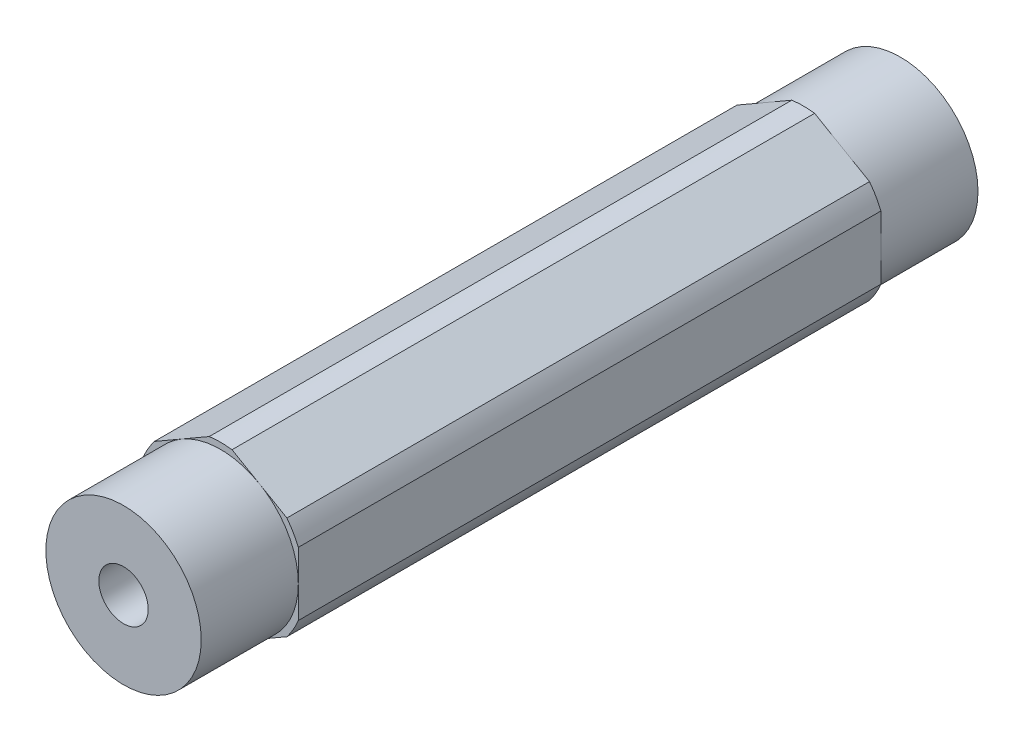
ISO-10303-21;
HEADER;
FILE_DESCRIPTION(('STEP AP214'),'2;1');
FILE_NAME('part.step','',(''),(''),'','','');
FILE_SCHEMA(('AUTOMOTIVE_DESIGN { 1 0 10303 214 1 1 1 1 }'));
ENDSEC;
DATA;
#1=APPLICATION_CONTEXT('core data for automotive mechanical design processes');
#2=APPLICATION_PROTOCOL_DEFINITION('international standard','automotive_design',2000,#1);
#3=PRODUCT_CONTEXT('',#1,'mechanical');
#4=PRODUCT('Part','Part','',(#3));
#5=PRODUCT_RELATED_PRODUCT_CATEGORY('part','',(#4));
#6=PRODUCT_DEFINITION_FORMATION('','',#4);
#7=PRODUCT_DEFINITION_CONTEXT('part definition',#1,'design');
#8=PRODUCT_DEFINITION('design','',#6,#7);
#9=PRODUCT_DEFINITION_SHAPE('','',#8);
#10=(LENGTH_UNIT() NAMED_UNIT(*) SI_UNIT(.MILLI.,.METRE.));
#11=(NAMED_UNIT(*) PLANE_ANGLE_UNIT() SI_UNIT($,.RADIAN.));
#12=(NAMED_UNIT(*) SI_UNIT($,.STERADIAN.) SOLID_ANGLE_UNIT());
#13=UNCERTAINTY_MEASURE_WITH_UNIT(LENGTH_MEASURE(1.E-05),#10,'distance_accuracy_value','');
#14=(GEOMETRIC_REPRESENTATION_CONTEXT(3) GLOBAL_UNCERTAINTY_ASSIGNED_CONTEXT((#13)) GLOBAL_UNIT_ASSIGNED_CONTEXT((#10,
#11,#12)) REPRESENTATION_CONTEXT('',''));
#15=CARTESIAN_POINT('',(0.,0.,0.));
#16=DIRECTION('',(0.,0.,1.));
#17=DIRECTION('',(1.,0.,0.));
#18=AXIS2_PLACEMENT_3D('',#15,#16,#17);
#19=CARTESIAN_POINT('',(6.35,0.,31.75));
#20=DIRECTION('',(-1.,0.,0.));
#21=DIRECTION('',(0.,0.,1.));
#22=AXIS2_PLACEMENT_3D('',#19,#20,#21);
#23=PLANE('',#22);
#24=DIRECTION('',(0.,-1.,0.));
#25=VECTOR('',#24,1.);
#26=CARTESIAN_POINT('',(6.35,0.,-23.8125));
#27=LINE('',#26,#25);
#28=CARTESIAN_POINT('',(6.35,2.59030191290514,-23.8125));
#29=VERTEX_POINT('',#28);
#30=CARTESIAN_POINT('',(6.35,0.,-23.8125));
#31=VERTEX_POINT('',#30);
#32=EDGE_CURVE('E226',#29,#31,#27,.T.);
#33=ORIENTED_EDGE('',*,*,#32,.F.);
#34=DIRECTION('',(0.,0.,-1.));
#35=VECTOR('',#34,1.);
#36=CARTESIAN_POINT('',(6.35,2.59030191290514,31.75));
#37=LINE('',#36,#35);
#38=CARTESIAN_POINT('',(6.35,2.59030191290514,23.8125));
#39=VERTEX_POINT('',#38);
#40=EDGE_CURVE('E346',#39,#29,#37,.T.);
#41=ORIENTED_EDGE('',*,*,#40,.F.);
#42=DIRECTION('',(0.,1.,0.));
#43=VECTOR('',#42,1.);
#44=CARTESIAN_POINT('',(6.35,0.,23.8125));
#45=LINE('',#44,#43);
#46=CARTESIAN_POINT('',(6.35,0.,23.8125));
#47=VERTEX_POINT('',#46);
#48=EDGE_CURVE('E298',#47,#39,#45,.T.);
#49=ORIENTED_EDGE('',*,*,#48,.F.);
#50=CARTESIAN_POINT('',(6.35,-2.59030191290514,23.8125));
#51=VERTEX_POINT('',#50);
#52=EDGE_CURVE('E301',#51,#47,#45,.T.);
#53=ORIENTED_EDGE('',*,*,#52,.F.);
#54=DIRECTION('',(0.,0.,-1.));
#55=VECTOR('',#54,1.);
#56=CARTESIAN_POINT('',(6.35,-2.59030191290514,31.75));
#57=LINE('',#56,#55);
#58=CARTESIAN_POINT('',(6.35,-2.59030191290514,-23.8125));
#59=VERTEX_POINT('',#58);
#60=EDGE_CURVE('E302',#51,#59,#57,.T.);
#61=ORIENTED_EDGE('',*,*,#60,.T.);
#62=EDGE_CURVE('E73',#31,#59,#27,.T.);
#63=ORIENTED_EDGE('',*,*,#62,.F.);
#64=EDGE_LOOP('',(#33,#41,#49,#53,#61,#63));
#65=FACE_BOUND('',#64,.T.);
#66=ADVANCED_FACE('F59',(#65),#23,.F.);
#67=CARTESIAN_POINT('',(0.,0.,31.75));
#68=DIRECTION('',(0.,0.,-1.));
#69=DIRECTION('',(-1.,0.,0.));
#70=AXIS2_PLACEMENT_3D('',#67,#68,#69);
#71=CYLINDRICAL_SURFACE('',#70,6.858);
#72=CARTESIAN_POINT('',(0.,0.,-23.8125));
#73=DIRECTION('',(0.,0.,-1.));
#74=DIRECTION('',(-1.,0.,0.));
#75=AXIS2_PLACEMENT_3D('',#72,#73,#74);
#76=CIRCLE('',#75,6.858);
#77=CARTESIAN_POINT('',(5.41826726004727,4.20411035757862,-23.8125));
#78=VERTEX_POINT('',#77);
#79=EDGE_CURVE('E233',#78,#29,#76,.T.);
#80=ORIENTED_EDGE('',*,*,#79,.F.);
#81=DIRECTION('',(0.,0.,-1.));
#82=VECTOR('',#81,1.);
#83=CARTESIAN_POINT('',(5.41826726004728,4.20411035757862,31.75));
#84=LINE('',#83,#82);
#85=CARTESIAN_POINT('',(5.41826726004727,4.20411035757862,23.8125));
#86=VERTEX_POINT('',#85);
#87=EDGE_CURVE('E342',#86,#78,#84,.T.);
#88=ORIENTED_EDGE('',*,*,#87,.F.);
#89=CARTESIAN_POINT('',(0.,0.,23.8125));
#90=DIRECTION('',(0.,0.,1.));
#91=DIRECTION('',(1.,0.,0.));
#92=AXIS2_PLACEMENT_3D('',#89,#90,#91);
#93=CIRCLE('',#92,6.858);
#94=EDGE_CURVE('E295',#39,#86,#93,.T.);
#95=ORIENTED_EDGE('',*,*,#94,.F.);
#96=ORIENTED_EDGE('',*,*,#40,.T.);
#97=EDGE_LOOP('',(#80,#88,#95,#96));
#98=FACE_BOUND('',#97,.T.);
#99=ADVANCED_FACE('F381',(#98),#71,.T.);
#100=CARTESIAN_POINT('',(3.175,5.49926131403118,31.75));
#101=DIRECTION('',(-0.5,-0.866025403784439,0.));
#102=DIRECTION('',(0.866025403784439,-0.5,0.));
#103=AXIS2_PLACEMENT_3D('',#100,#101,#102);
#104=PLANE('',#103);
#105=DIRECTION('',(0.866025403784439,-0.5,0.));
#106=VECTOR('',#105,1.);
#107=CARTESIAN_POINT('',(3.175,5.49926131403118,-23.8125));
#108=LINE('',#107,#106);
#109=CARTESIAN_POINT('',(0.931732739952726,6.79441227048375,-23.8125));
#110=VERTEX_POINT('',#109);
#111=CARTESIAN_POINT('',(3.175,5.49926131403118,-23.8125));
#112=VERTEX_POINT('',#111);
#113=EDGE_CURVE('E247',#110,#112,#108,.T.);
#114=ORIENTED_EDGE('',*,*,#113,.F.);
#115=DIRECTION('',(0.,0.,-1.));
#116=VECTOR('',#115,1.);
#117=CARTESIAN_POINT('',(0.931732739952726,6.79441227048375,31.75));
#118=LINE('',#117,#116);
#119=CARTESIAN_POINT('',(0.931732739952726,6.79441227048375,23.8125));
#120=VERTEX_POINT('',#119);
#121=EDGE_CURVE('E338',#120,#110,#118,.T.);
#122=ORIENTED_EDGE('',*,*,#121,.F.);
#123=DIRECTION('',(-0.866025403784439,0.5,0.));
#124=VECTOR('',#123,1.);
#125=CARTESIAN_POINT('',(3.175,5.49926131403118,23.8125));
#126=LINE('',#125,#124);
#127=CARTESIAN_POINT('',(3.175,5.49926131403118,23.8125));
#128=VERTEX_POINT('',#127);
#129=EDGE_CURVE('E291',#128,#120,#126,.T.);
#130=ORIENTED_EDGE('',*,*,#129,.F.);
#131=EDGE_CURVE('E294',#86,#128,#126,.T.);
#132=ORIENTED_EDGE('',*,*,#131,.F.);
#133=ORIENTED_EDGE('',*,*,#87,.T.);
#134=EDGE_CURVE('E243',#112,#78,#108,.T.);
#135=ORIENTED_EDGE('',*,*,#134,.F.);
#136=EDGE_LOOP('',(#114,#122,#130,#132,#133,#135));
#137=FACE_BOUND('',#136,.T.);
#138=ADVANCED_FACE('F387',(#137),#104,.F.);
#139=CARTESIAN_POINT('',(0.,0.,-23.8125));
#140=DIRECTION('',(0.,0.,-1.));
#141=DIRECTION('',(-1.,0.,0.));
#142=AXIS2_PLACEMENT_3D('',#139,#140,#141);
#143=CIRCLE('',#142,6.858);
#144=CARTESIAN_POINT('',(-0.931732739952728,6.79441227048375,-23.8125));
#145=VERTEX_POINT('',#144);
#146=EDGE_CURVE('E254',#145,#110,#143,.T.);
#147=ORIENTED_EDGE('',*,*,#146,.F.);
#148=DIRECTION('',(0.,0.,-1.));
#149=VECTOR('',#148,1.);
#150=CARTESIAN_POINT('',(-0.931732739952728,6.79441227048375,31.75));
#151=LINE('',#150,#149);
#152=CARTESIAN_POINT('',(-0.931732739952728,6.79441227048375,23.8125));
#153=VERTEX_POINT('',#152);
#154=EDGE_CURVE('E334',#153,#145,#151,.T.);
#155=ORIENTED_EDGE('',*,*,#154,.F.);
#156=CARTESIAN_POINT('',(0.,0.,23.8125));
#157=DIRECTION('',(0.,0.,1.));
#158=DIRECTION('',(1.,0.,0.));
#159=AXIS2_PLACEMENT_3D('',#156,#157,#158);
#160=CIRCLE('',#159,6.858);
#161=EDGE_CURVE('E288',#120,#153,#160,.T.);
#162=ORIENTED_EDGE('',*,*,#161,.F.);
#163=ORIENTED_EDGE('',*,*,#121,.T.);
#164=EDGE_LOOP('',(#147,#155,#162,#163));
#165=FACE_BOUND('',#164,.T.);
#166=ADVANCED_FACE('F389',(#165),#71,.T.);
#167=CARTESIAN_POINT('',(-3.175,5.49926131403119,31.75));
#168=DIRECTION('',(0.5,-0.866025403784439,0.));
#169=DIRECTION('',(0.866025403784439,0.5,0.));
#170=AXIS2_PLACEMENT_3D('',#167,#168,#169);
#171=PLANE('',#170);
#172=DIRECTION('',(0.866025403784439,0.5,0.));
#173=VECTOR('',#172,1.);
#174=CARTESIAN_POINT('',(-3.175,5.49926131403119,-23.8125));
#175=LINE('',#174,#173);
#176=CARTESIAN_POINT('',(-5.41826726004727,4.20411035757862,-23.8125));
#177=VERTEX_POINT('',#176);
#178=CARTESIAN_POINT('',(-3.175,5.49926131403119,-23.8125));
#179=VERTEX_POINT('',#178);
#180=EDGE_CURVE('E251',#177,#179,#175,.T.);
#181=ORIENTED_EDGE('',*,*,#180,.F.);
#182=DIRECTION('',(0.,0.,-1.));
#183=VECTOR('',#182,1.);
#184=CARTESIAN_POINT('',(-5.41826726004727,4.20411035757862,31.75));
#185=LINE('',#184,#183);
#186=CARTESIAN_POINT('',(-5.41826726004727,4.20411035757862,23.8125));
#187=VERTEX_POINT('',#186);
#188=EDGE_CURVE('E330',#187,#177,#185,.T.);
#189=ORIENTED_EDGE('',*,*,#188,.F.);
#190=DIRECTION('',(-0.866025403784439,-0.5,0.));
#191=VECTOR('',#190,1.);
#192=CARTESIAN_POINT('',(-3.175,5.49926131403119,23.8125));
#193=LINE('',#192,#191);
#194=CARTESIAN_POINT('',(-3.175,5.49926131403119,23.8125));
#195=VERTEX_POINT('',#194);
#196=EDGE_CURVE('E284',#195,#187,#193,.T.);
#197=ORIENTED_EDGE('',*,*,#196,.F.);
#198=EDGE_CURVE('E287',#153,#195,#193,.T.);
#199=ORIENTED_EDGE('',*,*,#198,.F.);
#200=ORIENTED_EDGE('',*,*,#154,.T.);
#201=EDGE_CURVE('E255',#179,#145,#175,.T.);
#202=ORIENTED_EDGE('',*,*,#201,.F.);
#203=EDGE_LOOP('',(#181,#189,#197,#199,#200,#202));
#204=FACE_BOUND('',#203,.T.);
#205=ADVANCED_FACE('F470',(#204),#171,.F.);
#206=CARTESIAN_POINT('',(0.,0.,-23.8125));
#207=DIRECTION('',(0.,0.,-1.));
#208=DIRECTION('',(-1.,0.,0.));
#209=AXIS2_PLACEMENT_3D('',#206,#207,#208);
#210=CIRCLE('',#209,6.858);
#211=CARTESIAN_POINT('',(-6.35,2.59030191290514,-23.8125));
#212=VERTEX_POINT('',#211);
#213=EDGE_CURVE('E248',#212,#177,#210,.T.);
#214=ORIENTED_EDGE('',*,*,#213,.F.);
#215=DIRECTION('',(0.,0.,-1.));
#216=VECTOR('',#215,1.);
#217=CARTESIAN_POINT('',(-6.35,2.59030191290514,31.75));
#218=LINE('',#217,#216);
#219=CARTESIAN_POINT('',(-6.35,2.59030191290514,23.8125));
#220=VERTEX_POINT('',#219);
#221=EDGE_CURVE('E326',#220,#212,#218,.T.);
#222=ORIENTED_EDGE('',*,*,#221,.F.);
#223=CARTESIAN_POINT('',(0.,0.,23.8125));
#224=DIRECTION('',(0.,0.,1.));
#225=DIRECTION('',(1.,0.,0.));
#226=AXIS2_PLACEMENT_3D('',#223,#224,#225);
#227=CIRCLE('',#226,6.858);
#228=EDGE_CURVE('E281',#187,#220,#227,.T.);
#229=ORIENTED_EDGE('',*,*,#228,.F.);
#230=ORIENTED_EDGE('',*,*,#188,.T.);
#231=EDGE_LOOP('',(#214,#222,#229,#230));
#232=FACE_BOUND('',#231,.T.);
#233=ADVANCED_FACE('F467',(#232),#71,.T.);
#234=CARTESIAN_POINT('',(-6.35,0.,31.75));
#235=DIRECTION('',(1.,0.,0.));
#236=DIRECTION('',(0.,1.,0.));
#237=AXIS2_PLACEMENT_3D('',#234,#235,#236);
#238=PLANE('',#237);
#239=DIRECTION('',(0.,1.,0.));
#240=VECTOR('',#239,1.);
#241=CARTESIAN_POINT('',(-6.35,0.,-23.8125));
#242=LINE('',#241,#240);
#243=CARTESIAN_POINT('',(-6.35,-2.59030191290514,-23.8125));
#244=VERTEX_POINT('',#243);
#245=CARTESIAN_POINT('',(-6.35,0.,-23.8125));
#246=VERTEX_POINT('',#245);
#247=EDGE_CURVE('E240',#244,#246,#242,.T.);
#248=ORIENTED_EDGE('',*,*,#247,.F.);
#249=DIRECTION('',(0.,0.,-1.));
#250=VECTOR('',#249,1.);
#251=CARTESIAN_POINT('',(-6.35,-2.59030191290514,31.75));
#252=LINE('',#251,#250);
#253=CARTESIAN_POINT('',(-6.35,-2.59030191290514,23.8125));
#254=VERTEX_POINT('',#253);
#255=EDGE_CURVE('E322',#254,#244,#252,.T.);
#256=ORIENTED_EDGE('',*,*,#255,.F.);
#257=DIRECTION('',(0.,-1.,0.));
#258=VECTOR('',#257,1.);
#259=CARTESIAN_POINT('',(-6.35,0.,23.8125));
#260=LINE('',#259,#258);
#261=CARTESIAN_POINT('',(-6.35,0.,23.8125));
#262=VERTEX_POINT('',#261);
#263=EDGE_CURVE('E277',#262,#254,#260,.T.);
#264=ORIENTED_EDGE('',*,*,#263,.F.);
#265=EDGE_CURVE('E280',#220,#262,#260,.T.);
#266=ORIENTED_EDGE('',*,*,#265,.F.);
#267=ORIENTED_EDGE('',*,*,#221,.T.);
#268=EDGE_CURVE('E244',#246,#212,#242,.T.);
#269=ORIENTED_EDGE('',*,*,#268,.F.);
#270=EDGE_LOOP('',(#248,#256,#264,#266,#267,#269));
#271=FACE_BOUND('',#270,.T.);
#272=ADVANCED_FACE('F460',(#271),#238,.F.);
#273=CARTESIAN_POINT('',(0.,0.,-23.8125));
#274=DIRECTION('',(0.,0.,-1.));
#275=DIRECTION('',(-1.,0.,0.));
#276=AXIS2_PLACEMENT_3D('',#273,#274,#275);
#277=CIRCLE('',#276,6.858);
#278=CARTESIAN_POINT('',(-5.41826726004728,-4.20411035757861,-23.8125));
#279=VERTEX_POINT('',#278);
#280=EDGE_CURVE('E237',#279,#244,#277,.T.);
#281=ORIENTED_EDGE('',*,*,#280,.F.);
#282=DIRECTION('',(0.,0.,-1.));
#283=VECTOR('',#282,1.);
#284=CARTESIAN_POINT('',(-5.41826726004728,-4.20411035757861,31.75));
#285=LINE('',#284,#283);
#286=CARTESIAN_POINT('',(-5.41826726004728,-4.20411035757861,23.8125));
#287=VERTEX_POINT('',#286);
#288=EDGE_CURVE('E318',#287,#279,#285,.T.);
#289=ORIENTED_EDGE('',*,*,#288,.F.);
#290=CARTESIAN_POINT('',(0.,0.,23.8125));
#291=DIRECTION('',(0.,0.,1.));
#292=DIRECTION('',(1.,0.,0.));
#293=AXIS2_PLACEMENT_3D('',#290,#291,#292);
#294=CIRCLE('',#293,6.858);
#295=EDGE_CURVE('E274',#254,#287,#294,.T.);
#296=ORIENTED_EDGE('',*,*,#295,.F.);
#297=ORIENTED_EDGE('',*,*,#255,.T.);
#298=EDGE_LOOP('',(#281,#289,#296,#297));
#299=FACE_BOUND('',#298,.T.);
#300=ADVANCED_FACE('F503',(#299),#71,.T.);
#301=CARTESIAN_POINT('',(-3.175,-5.49926131403118,31.75));
#302=DIRECTION('',(0.5,0.866025403784439,0.));
#303=DIRECTION('',(-0.866025403784439,0.5,0.));
#304=AXIS2_PLACEMENT_3D('',#301,#302,#303);
#305=PLANE('',#304);
#306=DIRECTION('',(-0.866025403784439,0.5,0.));
#307=VECTOR('',#306,1.);
#308=CARTESIAN_POINT('',(-3.175,-5.49926131403118,-23.8125));
#309=LINE('',#308,#307);
#310=CARTESIAN_POINT('',(-0.931732739952717,-6.79441227048375,-23.8125));
#311=VERTEX_POINT('',#310);
#312=CARTESIAN_POINT('',(-3.175,-5.49926131403118,-23.8125));
#313=VERTEX_POINT('',#312);
#314=EDGE_CURVE('E230',#311,#313,#309,.T.);
#315=ORIENTED_EDGE('',*,*,#314,.F.);
#316=DIRECTION('',(0.,0.,-1.));
#317=VECTOR('',#316,1.);
#318=CARTESIAN_POINT('',(-0.931732739952717,-6.79441227048375,31.75));
#319=LINE('',#318,#317);
#320=CARTESIAN_POINT('',(-0.931732739952717,-6.79441227048375,23.8125));
#321=VERTEX_POINT('',#320);
#322=EDGE_CURVE('E314',#321,#311,#319,.T.);
#323=ORIENTED_EDGE('',*,*,#322,.F.);
#324=DIRECTION('',(0.866025403784439,-0.5,0.));
#325=VECTOR('',#324,1.);
#326=CARTESIAN_POINT('',(-3.175,-5.49926131403118,23.8125));
#327=LINE('',#326,#325);
#328=CARTESIAN_POINT('',(-3.175,-5.49926131403118,23.8125));
#329=VERTEX_POINT('',#328);
#330=EDGE_CURVE('E270',#329,#321,#327,.T.);
#331=ORIENTED_EDGE('',*,*,#330,.F.);
#332=EDGE_CURVE('E273',#287,#329,#327,.T.);
#333=ORIENTED_EDGE('',*,*,#332,.F.);
#334=ORIENTED_EDGE('',*,*,#288,.T.);
#335=EDGE_CURVE('E234',#313,#279,#309,.T.);
#336=ORIENTED_EDGE('',*,*,#335,.F.);
#337=EDGE_LOOP('',(#315,#323,#331,#333,#334,#336));
#338=FACE_BOUND('',#337,.T.);
#339=ADVANCED_FACE('F497',(#338),#305,.F.);
#340=CARTESIAN_POINT('',(0.,0.,-23.8125));
#341=DIRECTION('',(0.,0.,-1.));
#342=DIRECTION('',(-1.,0.,0.));
#343=AXIS2_PLACEMENT_3D('',#340,#341,#342);
#344=CIRCLE('',#343,6.858);
#345=CARTESIAN_POINT('',(0.931732739952726,-6.79441227048375,-23.8125));
#346=VERTEX_POINT('',#345);
#347=EDGE_CURVE('E227',#346,#311,#344,.T.);
#348=ORIENTED_EDGE('',*,*,#347,.F.);
#349=DIRECTION('',(0.,0.,-1.));
#350=VECTOR('',#349,1.);
#351=CARTESIAN_POINT('',(0.931732739952726,-6.79441227048375,31.75));
#352=LINE('',#351,#350);
#353=CARTESIAN_POINT('',(0.931732739952726,-6.79441227048375,23.8125));
#354=VERTEX_POINT('',#353);
#355=EDGE_CURVE('E310',#354,#346,#352,.T.);
#356=ORIENTED_EDGE('',*,*,#355,.F.);
#357=CARTESIAN_POINT('',(0.,0.,23.8125));
#358=DIRECTION('',(0.,0.,1.));
#359=DIRECTION('',(1.,0.,0.));
#360=AXIS2_PLACEMENT_3D('',#357,#358,#359);
#361=CIRCLE('',#360,6.858);
#362=EDGE_CURVE('E267',#321,#354,#361,.T.);
#363=ORIENTED_EDGE('',*,*,#362,.F.);
#364=ORIENTED_EDGE('',*,*,#322,.T.);
#365=EDGE_LOOP('',(#348,#356,#363,#364));
#366=FACE_BOUND('',#365,.T.);
#367=ADVANCED_FACE('F492',(#366),#71,.T.);
#368=CARTESIAN_POINT('',(3.175,-5.49926131403118,31.75));
#369=DIRECTION('',(-0.5,0.866025403784439,0.));
#370=DIRECTION('',(-0.866025403784439,-0.5,0.));
#371=AXIS2_PLACEMENT_3D('',#368,#369,#370);
#372=PLANE('',#371);
#373=DIRECTION('',(-0.866025403784439,-0.5,0.));
#374=VECTOR('',#373,1.);
#375=CARTESIAN_POINT('',(3.175,-5.49926131403118,-23.8125));
#376=LINE('',#375,#374);
#377=CARTESIAN_POINT('',(5.41826726004727,-4.20411035757862,-23.8125));
#378=VERTEX_POINT('',#377);
#379=CARTESIAN_POINT('',(3.175,-5.49926131403118,-23.8125));
#380=VERTEX_POINT('',#379);
#381=EDGE_CURVE('E219',#378,#380,#376,.T.);
#382=ORIENTED_EDGE('',*,*,#381,.F.);
#383=DIRECTION('',(0.,0.,-1.));
#384=VECTOR('',#383,1.);
#385=CARTESIAN_POINT('',(5.41826726004728,-4.20411035757862,31.75));
#386=LINE('',#385,#384);
#387=CARTESIAN_POINT('',(5.41826726004728,-4.20411035757862,23.8125));
#388=VERTEX_POINT('',#387);
#389=EDGE_CURVE('E306',#388,#378,#386,.T.);
#390=ORIENTED_EDGE('',*,*,#389,.F.);
#391=DIRECTION('',(0.866025403784439,0.5,0.));
#392=VECTOR('',#391,1.);
#393=CARTESIAN_POINT('',(3.175,-5.49926131403118,23.8125));
#394=LINE('',#393,#392);
#395=CARTESIAN_POINT('',(3.175,-5.49926131403118,23.8125));
#396=VERTEX_POINT('',#395);
#397=EDGE_CURVE('E81',#396,#388,#394,.T.);
#398=ORIENTED_EDGE('',*,*,#397,.F.);
#399=EDGE_CURVE('E266',#354,#396,#394,.T.);
#400=ORIENTED_EDGE('',*,*,#399,.F.);
#401=ORIENTED_EDGE('',*,*,#355,.T.);
#402=EDGE_CURVE('E223',#380,#346,#376,.T.);
#403=ORIENTED_EDGE('',*,*,#402,.F.);
#404=EDGE_LOOP('',(#382,#390,#398,#400,#401,#403));
#405=FACE_BOUND('',#404,.T.);
#406=ADVANCED_FACE('F483',(#405),#372,.F.);
#407=CARTESIAN_POINT('',(0.,0.,-23.8125));
#408=DIRECTION('',(0.,0.,-1.));
#409=DIRECTION('',(-1.,0.,0.));
#410=AXIS2_PLACEMENT_3D('',#407,#408,#409);
#411=CIRCLE('',#410,6.858);
#412=EDGE_CURVE('E12',#59,#378,#411,.T.);
#413=ORIENTED_EDGE('',*,*,#412,.F.);
#414=ORIENTED_EDGE('',*,*,#60,.F.);
#415=CARTESIAN_POINT('',(0.,0.,23.8125));
#416=DIRECTION('',(0.,0.,1.));
#417=DIRECTION('',(1.,0.,0.));
#418=AXIS2_PLACEMENT_3D('',#415,#416,#417);
#419=CIRCLE('',#418,6.858);
#420=EDGE_CURVE('E354',#388,#51,#419,.T.);
#421=ORIENTED_EDGE('',*,*,#420,.F.);
#422=ORIENTED_EDGE('',*,*,#389,.T.);
#423=EDGE_LOOP('',(#413,#414,#421,#422));
#424=FACE_BOUND('',#423,.T.);
#425=ADVANCED_FACE('F390',(#424),#71,.T.);
#426=CARTESIAN_POINT('',(0.,0.,23.8125));
#427=DIRECTION('',(0.,0.,1.));
#428=DIRECTION('',(1.,0.,0.));
#429=AXIS2_PLACEMENT_3D('',#426,#427,#428);
#430=PLANE('',#429);
#431=ORIENTED_EDGE('',*,*,#52,.T.);
#432=CARTESIAN_POINT('',(0.,0.,23.8125));
#433=DIRECTION('',(0.,0.,1.));
#434=DIRECTION('',(1.,0.,0.));
#435=AXIS2_PLACEMENT_3D('',#432,#433,#434);
#436=CIRCLE('',#435,6.35);
#437=EDGE_CURVE('E263',#396,#47,#436,.T.);
#438=ORIENTED_EDGE('',*,*,#437,.F.);
#439=ORIENTED_EDGE('',*,*,#397,.T.);
#440=ORIENTED_EDGE('',*,*,#420,.T.);
#441=EDGE_LOOP('',(#431,#438,#439,#440));
#442=FACE_BOUND('',#441,.T.);
#443=ADVANCED_FACE('F542',(#442),#430,.T.);
#444=ORIENTED_EDGE('',*,*,#48,.T.);
#445=ORIENTED_EDGE('',*,*,#94,.T.);
#446=ORIENTED_EDGE('',*,*,#131,.T.);
#447=EDGE_CURVE('E258',#47,#128,#436,.T.);
#448=ORIENTED_EDGE('',*,*,#447,.F.);
#449=EDGE_LOOP('',(#444,#445,#446,#448));
#450=FACE_BOUND('',#449,.T.);
#451=ADVANCED_FACE('F402',(#450),#430,.T.);
#452=ORIENTED_EDGE('',*,*,#129,.T.);
#453=ORIENTED_EDGE('',*,*,#161,.T.);
#454=ORIENTED_EDGE('',*,*,#198,.T.);
#455=EDGE_CURVE('E262',#128,#195,#436,.T.);
#456=ORIENTED_EDGE('',*,*,#455,.F.);
#457=EDGE_LOOP('',(#452,#453,#454,#456));
#458=FACE_BOUND('',#457,.T.);
#459=ADVANCED_FACE('F515',(#458),#430,.T.);
#460=ORIENTED_EDGE('',*,*,#196,.T.);
#461=ORIENTED_EDGE('',*,*,#228,.T.);
#462=ORIENTED_EDGE('',*,*,#265,.T.);
#463=EDGE_CURVE('E418',#195,#262,#436,.T.);
#464=ORIENTED_EDGE('',*,*,#463,.F.);
#465=EDGE_LOOP('',(#460,#461,#462,#464));
#466=FACE_BOUND('',#465,.T.);
#467=ADVANCED_FACE('F513',(#466),#430,.T.);
#468=ORIENTED_EDGE('',*,*,#263,.T.);
#469=ORIENTED_EDGE('',*,*,#295,.T.);
#470=ORIENTED_EDGE('',*,*,#332,.T.);
#471=EDGE_CURVE('E421',#262,#329,#436,.T.);
#472=ORIENTED_EDGE('',*,*,#471,.F.);
#473=EDGE_LOOP('',(#468,#469,#470,#472));
#474=FACE_BOUND('',#473,.T.);
#475=ADVANCED_FACE('F507',(#474),#430,.T.);
#476=ORIENTED_EDGE('',*,*,#330,.T.);
#477=ORIENTED_EDGE('',*,*,#362,.T.);
#478=ORIENTED_EDGE('',*,*,#399,.T.);
#479=EDGE_CURVE('E424',#329,#396,#436,.T.);
#480=ORIENTED_EDGE('',*,*,#479,.F.);
#481=EDGE_LOOP('',(#476,#477,#478,#480));
#482=FACE_BOUND('',#481,.T.);
#483=ADVANCED_FACE('F537',(#482),#430,.T.);
#484=CARTESIAN_POINT('',(0.,0.,23.8125));
#485=DIRECTION('',(0.,0.,1.));
#486=DIRECTION('',(1.,0.,0.));
#487=AXIS2_PLACEMENT_3D('',#484,#485,#486);
#488=CYLINDRICAL_SURFACE('',#487,6.35);
#489=CARTESIAN_POINT('',(0.,0.,31.75));
#490=DIRECTION('',(0.,0.,1.));
#491=DIRECTION('',(1.,0.,0.));
#492=AXIS2_PLACEMENT_3D('',#489,#490,#491);
#493=CIRCLE('',#492,6.35);
#494=CARTESIAN_POINT('',(6.35,0.,31.75));
#495=VERTEX_POINT('',#494);
#496=EDGE_CURVE('E350',#495,#495,#493,.T.);
#497=ORIENTED_EDGE('',*,*,#496,.F.);
#498=EDGE_LOOP('',(#497));
#499=FACE_BOUND('',#498,.T.);
#500=ORIENTED_EDGE('',*,*,#437,.T.);
#501=ORIENTED_EDGE('',*,*,#447,.T.);
#502=ORIENTED_EDGE('',*,*,#455,.T.);
#503=ORIENTED_EDGE('',*,*,#463,.T.);
#504=ORIENTED_EDGE('',*,*,#471,.T.);
#505=ORIENTED_EDGE('',*,*,#479,.T.);
#506=EDGE_LOOP('',(#500,#501,#502,#503,#504,#505));
#507=FACE_BOUND('',#506,.T.);
#508=ADVANCED_FACE('F511',(#499,#507),#488,.T.);
#509=CARTESIAN_POINT('',(0.,0.,31.75));
#510=DIRECTION('',(0.,0.,1.));
#511=DIRECTION('',(1.,0.,0.));
#512=AXIS2_PLACEMENT_3D('',#509,#510,#511);
#513=PLANE('',#512);
#514=CARTESIAN_POINT('',(0.,0.,31.75));
#515=DIRECTION('',(0.,0.,1.));
#516=DIRECTION('',(1.,0.,0.));
#517=AXIS2_PLACEMENT_3D('',#514,#515,#516);
#518=CIRCLE('',#517,2.01929999999999);
#519=CARTESIAN_POINT('',(2.01929999999999,0.,31.75));
#520=VERTEX_POINT('',#519);
#521=EDGE_CURVE('E200',#520,#520,#518,.T.);
#522=ORIENTED_EDGE('',*,*,#521,.F.);
#523=EDGE_LOOP('',(#522));
#524=FACE_BOUND('',#523,.T.);
#525=ORIENTED_EDGE('',*,*,#496,.T.);
#526=EDGE_LOOP('',(#525));
#527=FACE_BOUND('',#526,.T.);
#528=ADVANCED_FACE('F527',(#524,#527),#513,.T.);
#529=CARTESIAN_POINT('',(0.,0.,-23.8125));
#530=DIRECTION('',(0.,0.,-1.));
#531=DIRECTION('',(-1.,0.,0.));
#532=AXIS2_PLACEMENT_3D('',#529,#530,#531);
#533=PLANE('',#532);
#534=ORIENTED_EDGE('',*,*,#201,.T.);
#535=ORIENTED_EDGE('',*,*,#146,.T.);
#536=ORIENTED_EDGE('',*,*,#113,.T.);
#537=CARTESIAN_POINT('',(0.,0.,-23.8125));
#538=DIRECTION('',(0.,0.,-1.));
#539=DIRECTION('',(-1.,0.,0.));
#540=AXIS2_PLACEMENT_3D('',#537,#538,#539);
#541=CIRCLE('',#540,6.35);
#542=EDGE_CURVE('E220',#179,#112,#541,.T.);
#543=ORIENTED_EDGE('',*,*,#542,.F.);
#544=EDGE_LOOP('',(#534,#535,#536,#543));
#545=FACE_BOUND('',#544,.T.);
#546=ADVANCED_FACE('F476',(#545),#533,.T.);
#547=ORIENTED_EDGE('',*,*,#180,.T.);
#548=EDGE_CURVE('E215',#246,#179,#541,.T.);
#549=ORIENTED_EDGE('',*,*,#548,.F.);
#550=ORIENTED_EDGE('',*,*,#268,.T.);
#551=ORIENTED_EDGE('',*,*,#213,.T.);
#552=EDGE_LOOP('',(#547,#549,#550,#551));
#553=FACE_BOUND('',#552,.T.);
#554=ADVANCED_FACE('F454',(#553),#533,.T.);
#555=ORIENTED_EDGE('',*,*,#134,.T.);
#556=ORIENTED_EDGE('',*,*,#79,.T.);
#557=ORIENTED_EDGE('',*,*,#32,.T.);
#558=EDGE_CURVE('E436',#112,#31,#541,.T.);
#559=ORIENTED_EDGE('',*,*,#558,.F.);
#560=EDGE_LOOP('',(#555,#556,#557,#559));
#561=FACE_BOUND('',#560,.T.);
#562=ADVANCED_FACE('F479',(#561),#533,.T.);
#563=ORIENTED_EDGE('',*,*,#247,.T.);
#564=EDGE_CURVE('E214',#313,#246,#541,.T.);
#565=ORIENTED_EDGE('',*,*,#564,.F.);
#566=ORIENTED_EDGE('',*,*,#335,.T.);
#567=ORIENTED_EDGE('',*,*,#280,.T.);
#568=EDGE_LOOP('',(#563,#565,#566,#567));
#569=FACE_BOUND('',#568,.T.);
#570=ADVANCED_FACE('F501',(#569),#533,.T.);
#571=ORIENTED_EDGE('',*,*,#314,.T.);
#572=EDGE_CURVE('E442',#380,#313,#541,.T.);
#573=ORIENTED_EDGE('',*,*,#572,.F.);
#574=ORIENTED_EDGE('',*,*,#402,.T.);
#575=ORIENTED_EDGE('',*,*,#347,.T.);
#576=EDGE_LOOP('',(#571,#573,#574,#575));
#577=FACE_BOUND('',#576,.T.);
#578=ADVANCED_FACE('F489',(#577),#533,.T.);
#579=ORIENTED_EDGE('',*,*,#62,.T.);
#580=ORIENTED_EDGE('',*,*,#412,.T.);
#581=ORIENTED_EDGE('',*,*,#381,.T.);
#582=EDGE_CURVE('E439',#31,#380,#541,.T.);
#583=ORIENTED_EDGE('',*,*,#582,.F.);
#584=EDGE_LOOP('',(#579,#580,#581,#583));
#585=FACE_BOUND('',#584,.T.);
#586=ADVANCED_FACE('F375',(#585),#533,.T.);
#587=CARTESIAN_POINT('',(0.,0.,-23.8125));
#588=DIRECTION('',(0.,0.,-1.));
#589=DIRECTION('',(-1.,0.,0.));
#590=AXIS2_PLACEMENT_3D('',#587,#588,#589);
#591=CYLINDRICAL_SURFACE('',#590,6.35);
#592=CARTESIAN_POINT('',(0.,0.,-31.75));
#593=DIRECTION('',(0.,0.,1.));
#594=DIRECTION('',(1.,0.,0.));
#595=AXIS2_PLACEMENT_3D('',#592,#593,#594);
#596=CIRCLE('',#595,6.35);
#597=CARTESIAN_POINT('',(6.35,0.,-31.75));
#598=VERTEX_POINT('',#597);
#599=EDGE_CURVE('E67',#598,#598,#596,.T.);
#600=ORIENTED_EDGE('',*,*,#599,.T.);
#601=EDGE_LOOP('',(#600));
#602=FACE_BOUND('',#601,.T.);
#603=ORIENTED_EDGE('',*,*,#558,.T.);
#604=ORIENTED_EDGE('',*,*,#582,.T.);
#605=ORIENTED_EDGE('',*,*,#572,.T.);
#606=ORIENTED_EDGE('',*,*,#564,.T.);
#607=ORIENTED_EDGE('',*,*,#548,.T.);
#608=ORIENTED_EDGE('',*,*,#542,.T.);
#609=EDGE_LOOP('',(#603,#604,#605,#606,#607,#608));
#610=FACE_BOUND('',#609,.T.);
#611=ADVANCED_FACE('F360',(#602,#610),#591,.T.);
#612=CARTESIAN_POINT('',(0.,0.,-31.75));
#613=DIRECTION('',(0.,0.,1.));
#614=DIRECTION('',(1.,0.,0.));
#615=AXIS2_PLACEMENT_3D('',#612,#613,#614);
#616=PLANE('',#615);
#617=CARTESIAN_POINT('',(0.,0.,-31.75));
#618=DIRECTION('',(0.,0.,-1.));
#619=DIRECTION('',(-1.,0.,0.));
#620=AXIS2_PLACEMENT_3D('',#617,#618,#619);
#621=CIRCLE('',#620,2.01929999999999);
#622=CARTESIAN_POINT('',(-2.01929999999999,0.,-31.75));
#623=VERTEX_POINT('',#622);
#624=EDGE_CURVE('E201',#623,#623,#621,.T.);
#625=ORIENTED_EDGE('',*,*,#624,.F.);
#626=EDGE_LOOP('',(#625));
#627=FACE_BOUND('',#626,.T.);
#628=ORIENTED_EDGE('',*,*,#599,.F.);
#629=EDGE_LOOP('',(#628));
#630=FACE_BOUND('',#629,.T.);
#631=ADVANCED_FACE('F363',(#627,#630),#616,.F.);
#632=CARTESIAN_POINT('',(0.,0.,19.72056));
#633=DIRECTION('',(0.,0.,1.));
#634=DIRECTION('',(1.,0.,0.));
#635=AXIS2_PLACEMENT_3D('',#632,#633,#634);
#636=CONICAL_SURFACE('',#635,2.01929999999999,1.02974425867665);
#637=CARTESIAN_POINT('',(0.,0.,18.5072421519977));
#638=VERTEX_POINT('',#637);
#639=VERTEX_LOOP('',#638);
#640=FACE_BOUND('',#639,.T.);
#641=CARTESIAN_POINT('',(0.,0.,19.72056));
#642=DIRECTION('',(0.,0.,1.));
#643=DIRECTION('',(1.,0.,0.));
#644=AXIS2_PLACEMENT_3D('',#641,#642,#643);
#645=CIRCLE('',#644,2.01929999999999);
#646=CARTESIAN_POINT('',(2.01929999999999,0.,19.72056));
#647=VERTEX_POINT('',#646);
#648=EDGE_CURVE('E206',#647,#647,#645,.T.);
#649=ORIENTED_EDGE('',*,*,#648,.T.);
#650=EDGE_LOOP('',(#649));
#651=FACE_BOUND('',#650,.T.);
#652=ADVANCED_FACE('F365',(#640,#651),#636,.F.);
#653=CARTESIAN_POINT('',(0.,0.,31.75));
#654=DIRECTION('',(0.,0.,1.));
#655=DIRECTION('',(1.,0.,0.));
#656=AXIS2_PLACEMENT_3D('',#653,#654,#655);
#657=CYLINDRICAL_SURFACE('',#656,2.01929999999999);
#658=ORIENTED_EDGE('',*,*,#648,.F.);
#659=EDGE_LOOP('',(#658));
#660=FACE_BOUND('',#659,.T.);
#661=ORIENTED_EDGE('',*,*,#521,.T.);
#662=EDGE_LOOP('',(#661));
#663=FACE_BOUND('',#662,.T.);
#664=ADVANCED_FACE('F193',(#660,#663),#657,.F.);
#665=CARTESIAN_POINT('',(0.,0.,-19.72056));
#666=DIRECTION('',(0.,0.,-1.));
#667=DIRECTION('',(-1.,0.,0.));
#668=AXIS2_PLACEMENT_3D('',#665,#666,#667);
#669=CONICAL_SURFACE('',#668,2.01929999999999,1.02974425867665);
#670=CARTESIAN_POINT('',(0.,0.,-18.5072421519977));
#671=VERTEX_POINT('',#670);
#672=VERTEX_LOOP('',#671);
#673=FACE_BOUND('',#672,.T.);
#674=CARTESIAN_POINT('',(0.,0.,-19.72056));
#675=DIRECTION('',(0.,0.,-1.));
#676=DIRECTION('',(-1.,0.,0.));
#677=AXIS2_PLACEMENT_3D('',#674,#675,#676);
#678=CIRCLE('',#677,2.01929999999999);
#679=CARTESIAN_POINT('',(-2.01929999999999,0.,-19.72056));
#680=VERTEX_POINT('',#679);
#681=EDGE_CURVE('E197',#680,#680,#678,.T.);
#682=ORIENTED_EDGE('',*,*,#681,.T.);
#683=EDGE_LOOP('',(#682));
#684=FACE_BOUND('',#683,.T.);
#685=ADVANCED_FACE('F189',(#673,#684),#669,.F.);
#686=CARTESIAN_POINT('',(0.,0.,-31.75));
#687=DIRECTION('',(0.,0.,-1.));
#688=DIRECTION('',(-1.,0.,0.));
#689=AXIS2_PLACEMENT_3D('',#686,#687,#688);
#690=CYLINDRICAL_SURFACE('',#689,2.01929999999999);
#691=ORIENTED_EDGE('',*,*,#681,.F.);
#692=EDGE_LOOP('',(#691));
#693=FACE_BOUND('',#692,.T.);
#694=ORIENTED_EDGE('',*,*,#624,.T.);
#695=EDGE_LOOP('',(#694));
#696=FACE_BOUND('',#695,.T.);
#697=ADVANCED_FACE('F192',(#693,#696),#690,.F.);
#698=CLOSED_SHELL('',(#66,#99,#138,#166,#205,#233,#272,#300,#339,#367,#406,#425,#443,#451,#459,
#467,#475,#483,#508,#528,#546,#554,#562,#570,#578,#586,#611,#631,#652,#664,#685,#697));
#699=MANIFOLD_SOLID_BREP('B2',#698);
#700=ADVANCED_BREP_SHAPE_REPRESENTATION('',(#18,#699),#14);
#701=SHAPE_DEFINITION_REPRESENTATION(#9,#700);
ENDSEC;
END-ISO-10303-21;
